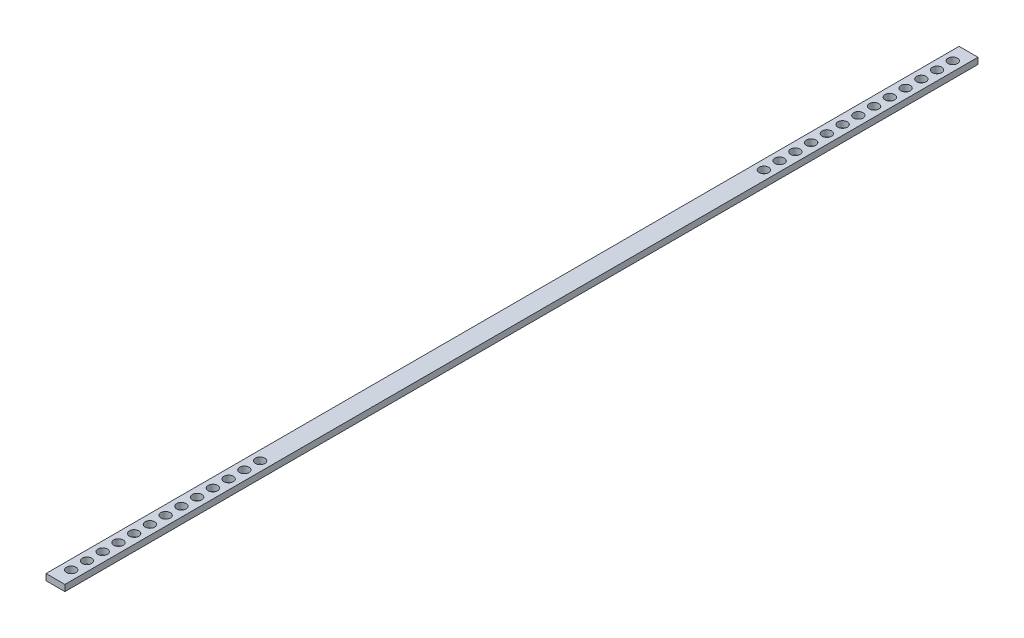
ISO-10303-21;
HEADER;
FILE_DESCRIPTION(('STEP AP214'),'2;1');
FILE_NAME('part.step','',(''),(''),'','','');
FILE_SCHEMA(('AUTOMOTIVE_DESIGN { 1 0 10303 214 1 1 1 1 }'));
ENDSEC;
DATA;
#1=APPLICATION_CONTEXT('core data for automotive mechanical design processes');
#2=APPLICATION_PROTOCOL_DEFINITION('international standard','automotive_design',2000,#1);
#3=PRODUCT_CONTEXT('',#1,'mechanical');
#4=PRODUCT('Part','Part','',(#3));
#5=PRODUCT_RELATED_PRODUCT_CATEGORY('part','',(#4));
#6=PRODUCT_DEFINITION_FORMATION('','',#4);
#7=PRODUCT_DEFINITION_CONTEXT('part definition',#1,'design');
#8=PRODUCT_DEFINITION('design','',#6,#7);
#9=PRODUCT_DEFINITION_SHAPE('','',#8);
#10=(LENGTH_UNIT() NAMED_UNIT(*) SI_UNIT(.MILLI.,.METRE.));
#11=(NAMED_UNIT(*) PLANE_ANGLE_UNIT() SI_UNIT($,.RADIAN.));
#12=(NAMED_UNIT(*) SI_UNIT($,.STERADIAN.) SOLID_ANGLE_UNIT());
#13=UNCERTAINTY_MEASURE_WITH_UNIT(LENGTH_MEASURE(1.E-05),#10,'distance_accuracy_value','');
#14=(GEOMETRIC_REPRESENTATION_CONTEXT(3) GLOBAL_UNCERTAINTY_ASSIGNED_CONTEXT((#13)) GLOBAL_UNIT_ASSIGNED_CONTEXT((#10,
#11,#12)) REPRESENTATION_CONTEXT('',''));
#15=CARTESIAN_POINT('',(0.,0.,0.));
#16=DIRECTION('',(0.,0.,1.));
#17=DIRECTION('',(1.,0.,0.));
#18=AXIS2_PLACEMENT_3D('',#15,#16,#17);
#19=CARTESIAN_POINT('',(0.,0.,580.));
#20=DIRECTION('',(1.,0.,0.));
#21=DIRECTION('',(0.,0.,-1.));
#22=AXIS2_PLACEMENT_3D('',#19,#20,#21);
#23=PLANE('',#22);
#24=DIRECTION('',(0.,-1.,0.));
#25=VECTOR('',#24,1.);
#26=CARTESIAN_POINT('',(0.,0.,0.));
#27=LINE('',#26,#25);
#28=CARTESIAN_POINT('',(0.,4.,0.));
#29=VERTEX_POINT('',#28);
#30=CARTESIAN_POINT('',(0.,0.,0.));
#31=VERTEX_POINT('',#30);
#32=EDGE_CURVE('E107',#29,#31,#27,.T.);
#33=ORIENTED_EDGE('',*,*,#32,.T.);
#34=DIRECTION('',(0.,0.,-1.));
#35=VECTOR('',#34,1.);
#36=CARTESIAN_POINT('',(0.,0.,580.));
#37=LINE('',#36,#35);
#38=CARTESIAN_POINT('',(0.,0.,580.));
#39=VERTEX_POINT('',#38);
#40=EDGE_CURVE('E11',#39,#31,#37,.T.);
#41=ORIENTED_EDGE('',*,*,#40,.F.);
#42=DIRECTION('',(0.,-1.,0.));
#43=VECTOR('',#42,1.);
#44=CARTESIAN_POINT('',(0.,0.,580.));
#45=LINE('',#44,#43);
#46=CARTESIAN_POINT('',(0.,4.,580.));
#47=VERTEX_POINT('',#46);
#48=EDGE_CURVE('E91',#47,#39,#45,.T.);
#49=ORIENTED_EDGE('',*,*,#48,.F.);
#50=DIRECTION('',(0.,0.,-1.));
#51=VECTOR('',#50,1.);
#52=CARTESIAN_POINT('',(0.,4.,580.));
#53=LINE('',#52,#51);
#54=EDGE_CURVE('E103',#47,#29,#53,.T.);
#55=ORIENTED_EDGE('',*,*,#54,.T.);
#56=EDGE_LOOP('',(#33,#41,#49,#55));
#57=FACE_BOUND('',#56,.T.);
#58=ADVANCED_FACE('F39',(#57),#23,.F.);
#59=CARTESIAN_POINT('',(0.,0.,580.));
#60=DIRECTION('',(0.,1.,0.));
#61=DIRECTION('',(0.,0.,1.));
#62=AXIS2_PLACEMENT_3D('',#59,#60,#61);
#63=PLANE('',#62);
#64=CARTESIAN_POINT('',(6.,0.,10.));
#65=DIRECTION('',(0.,1.,0.));
#66=DIRECTION('',(0.,0.,1.));
#67=AXIS2_PLACEMENT_3D('',#64,#65,#66);
#68=CIRCLE('',#67,3.);
#69=CARTESIAN_POINT('',(6.,0.,13.));
#70=VERTEX_POINT('',#69);
#71=EDGE_CURVE('E111',#70,#70,#68,.T.);
#72=ORIENTED_EDGE('',*,*,#71,.T.);
#73=EDGE_LOOP('',(#72));
#74=FACE_BOUND('',#73,.T.);
#75=CARTESIAN_POINT('',(6.,0.,20.));
#76=DIRECTION('',(0.,1.,0.));
#77=DIRECTION('',(0.,0.,1.));
#78=AXIS2_PLACEMENT_3D('',#75,#76,#77);
#79=CIRCLE('',#78,3.);
#80=CARTESIAN_POINT('',(6.,0.,23.));
#81=VERTEX_POINT('',#80);
#82=EDGE_CURVE('E324',#81,#81,#79,.T.);
#83=ORIENTED_EDGE('',*,*,#82,.T.);
#84=EDGE_LOOP('',(#83));
#85=FACE_BOUND('',#84,.T.);
#86=CARTESIAN_POINT('',(6.,0.,30.));
#87=DIRECTION('',(0.,1.,0.));
#88=DIRECTION('',(0.,0.,1.));
#89=AXIS2_PLACEMENT_3D('',#86,#87,#88);
#90=CIRCLE('',#89,3.);
#91=CARTESIAN_POINT('',(6.,0.,33.));
#92=VERTEX_POINT('',#91);
#93=EDGE_CURVE('E316',#92,#92,#90,.T.);
#94=ORIENTED_EDGE('',*,*,#93,.T.);
#95=EDGE_LOOP('',(#94));
#96=FACE_BOUND('',#95,.T.);
#97=CARTESIAN_POINT('',(6.,0.,40.));
#98=DIRECTION('',(0.,1.,0.));
#99=DIRECTION('',(0.,0.,1.));
#100=AXIS2_PLACEMENT_3D('',#97,#98,#99);
#101=CIRCLE('',#100,3.);
#102=CARTESIAN_POINT('',(6.,0.,43.));
#103=VERTEX_POINT('',#102);
#104=EDGE_CURVE('E308',#103,#103,#101,.T.);
#105=ORIENTED_EDGE('',*,*,#104,.T.);
#106=EDGE_LOOP('',(#105));
#107=FACE_BOUND('',#106,.T.);
#108=CARTESIAN_POINT('',(6.00000000000001,0.,50.));
#109=DIRECTION('',(0.,1.,0.));
#110=DIRECTION('',(0.,0.,1.));
#111=AXIS2_PLACEMENT_3D('',#108,#109,#110);
#112=CIRCLE('',#111,3.);
#113=CARTESIAN_POINT('',(6.00000000000001,0.,53.));
#114=VERTEX_POINT('',#113);
#115=EDGE_CURVE('E300',#114,#114,#112,.T.);
#116=ORIENTED_EDGE('',*,*,#115,.T.);
#117=EDGE_LOOP('',(#116));
#118=FACE_BOUND('',#117,.T.);
#119=CARTESIAN_POINT('',(6.00000000000001,0.,60.));
#120=DIRECTION('',(0.,1.,0.));
#121=DIRECTION('',(0.,0.,1.));
#122=AXIS2_PLACEMENT_3D('',#119,#120,#121);
#123=CIRCLE('',#122,3.);
#124=CARTESIAN_POINT('',(6.00000000000001,0.,63.));
#125=VERTEX_POINT('',#124);
#126=EDGE_CURVE('E292',#125,#125,#123,.T.);
#127=ORIENTED_EDGE('',*,*,#126,.T.);
#128=EDGE_LOOP('',(#127));
#129=FACE_BOUND('',#128,.T.);
#130=CARTESIAN_POINT('',(6.00000000000001,0.,70.));
#131=DIRECTION('',(0.,1.,0.));
#132=DIRECTION('',(0.,0.,1.));
#133=AXIS2_PLACEMENT_3D('',#130,#131,#132);
#134=CIRCLE('',#133,3.00000000000001);
#135=CARTESIAN_POINT('',(6.00000000000001,0.,73.));
#136=VERTEX_POINT('',#135);
#137=EDGE_CURVE('E284',#136,#136,#134,.T.);
#138=ORIENTED_EDGE('',*,*,#137,.T.);
#139=EDGE_LOOP('',(#138));
#140=FACE_BOUND('',#139,.T.);
#141=CARTESIAN_POINT('',(6.00000000000001,0.,80.));
#142=DIRECTION('',(0.,1.,0.));
#143=DIRECTION('',(0.,0.,1.));
#144=AXIS2_PLACEMENT_3D('',#141,#142,#143);
#145=CIRCLE('',#144,3.);
#146=CARTESIAN_POINT('',(6.00000000000001,0.,83.));
#147=VERTEX_POINT('',#146);
#148=EDGE_CURVE('E276',#147,#147,#145,.T.);
#149=ORIENTED_EDGE('',*,*,#148,.T.);
#150=EDGE_LOOP('',(#149));
#151=FACE_BOUND('',#150,.T.);
#152=CARTESIAN_POINT('',(6.00000000000001,0.,90.));
#153=DIRECTION('',(0.,1.,0.));
#154=DIRECTION('',(0.,0.,1.));
#155=AXIS2_PLACEMENT_3D('',#152,#153,#154);
#156=CIRCLE('',#155,3.);
#157=CARTESIAN_POINT('',(6.00000000000001,0.,93.));
#158=VERTEX_POINT('',#157);
#159=EDGE_CURVE('E268',#158,#158,#156,.T.);
#160=ORIENTED_EDGE('',*,*,#159,.T.);
#161=EDGE_LOOP('',(#160));
#162=FACE_BOUND('',#161,.T.);
#163=CARTESIAN_POINT('',(6.00000000000001,0.,100.));
#164=DIRECTION('',(0.,1.,0.));
#165=DIRECTION('',(0.,0.,1.));
#166=AXIS2_PLACEMENT_3D('',#163,#164,#165);
#167=CIRCLE('',#166,3.00000000000001);
#168=CARTESIAN_POINT('',(6.00000000000001,0.,103.));
#169=VERTEX_POINT('',#168);
#170=EDGE_CURVE('E260',#169,#169,#167,.T.);
#171=ORIENTED_EDGE('',*,*,#170,.T.);
#172=EDGE_LOOP('',(#171));
#173=FACE_BOUND('',#172,.T.);
#174=CARTESIAN_POINT('',(6.00000000000001,0.,110.));
#175=DIRECTION('',(0.,1.,0.));
#176=DIRECTION('',(0.,0.,1.));
#177=AXIS2_PLACEMENT_3D('',#174,#175,#176);
#178=CIRCLE('',#177,3.00000000000001);
#179=CARTESIAN_POINT('',(6.00000000000001,0.,113.));
#180=VERTEX_POINT('',#179);
#181=EDGE_CURVE('E252',#180,#180,#178,.T.);
#182=ORIENTED_EDGE('',*,*,#181,.T.);
#183=EDGE_LOOP('',(#182));
#184=FACE_BOUND('',#183,.T.);
#185=CARTESIAN_POINT('',(6.00000000000002,0.,120.));
#186=DIRECTION('',(0.,1.,0.));
#187=DIRECTION('',(0.,0.,1.));
#188=AXIS2_PLACEMENT_3D('',#185,#186,#187);
#189=CIRCLE('',#188,3.);
#190=CARTESIAN_POINT('',(6.00000000000002,0.,123.));
#191=VERTEX_POINT('',#190);
#192=EDGE_CURVE('E244',#191,#191,#189,.T.);
#193=ORIENTED_EDGE('',*,*,#192,.T.);
#194=EDGE_LOOP('',(#193));
#195=FACE_BOUND('',#194,.T.);
#196=CARTESIAN_POINT('',(6.00000000000002,0.,130.));
#197=DIRECTION('',(0.,1.,0.));
#198=DIRECTION('',(0.,0.,1.));
#199=AXIS2_PLACEMENT_3D('',#196,#197,#198);
#200=CIRCLE('',#199,3.);
#201=CARTESIAN_POINT('',(6.00000000000002,0.,133.));
#202=VERTEX_POINT('',#201);
#203=EDGE_CURVE('E236',#202,#202,#200,.T.);
#204=ORIENTED_EDGE('',*,*,#203,.T.);
#205=EDGE_LOOP('',(#204));
#206=FACE_BOUND('',#205,.T.);
#207=CARTESIAN_POINT('',(6.00000000000002,0.,450.));
#208=DIRECTION('',(0.,1.,0.));
#209=DIRECTION('',(0.,0.,-1.));
#210=AXIS2_PLACEMENT_3D('',#207,#208,#209);
#211=CIRCLE('',#210,3.);
#212=CARTESIAN_POINT('',(6.00000000000002,0.,447.));
#213=VERTEX_POINT('',#212);
#214=EDGE_CURVE('E228',#213,#213,#211,.T.);
#215=ORIENTED_EDGE('',*,*,#214,.T.);
#216=EDGE_LOOP('',(#215));
#217=FACE_BOUND('',#216,.T.);
#218=CARTESIAN_POINT('',(6.00000000000002,0.,460.));
#219=DIRECTION('',(0.,1.,0.));
#220=DIRECTION('',(0.,0.,-1.));
#221=AXIS2_PLACEMENT_3D('',#218,#219,#220);
#222=CIRCLE('',#221,3.);
#223=CARTESIAN_POINT('',(6.00000000000002,0.,457.));
#224=VERTEX_POINT('',#223);
#225=EDGE_CURVE('E220',#224,#224,#222,.T.);
#226=ORIENTED_EDGE('',*,*,#225,.T.);
#227=EDGE_LOOP('',(#226));
#228=FACE_BOUND('',#227,.T.);
#229=CARTESIAN_POINT('',(6.00000000000001,0.,470.));
#230=DIRECTION('',(0.,1.,0.));
#231=DIRECTION('',(0.,0.,-1.));
#232=AXIS2_PLACEMENT_3D('',#229,#230,#231);
#233=CIRCLE('',#232,3.00000000000001);
#234=CARTESIAN_POINT('',(6.00000000000001,0.,467.));
#235=VERTEX_POINT('',#234);
#236=EDGE_CURVE('E212',#235,#235,#233,.T.);
#237=ORIENTED_EDGE('',*,*,#236,.T.);
#238=EDGE_LOOP('',(#237));
#239=FACE_BOUND('',#238,.T.);
#240=CARTESIAN_POINT('',(6.00000000000001,0.,480.));
#241=DIRECTION('',(0.,1.,0.));
#242=DIRECTION('',(0.,0.,-1.));
#243=AXIS2_PLACEMENT_3D('',#240,#241,#242);
#244=CIRCLE('',#243,3.00000000000001);
#245=CARTESIAN_POINT('',(6.00000000000001,0.,477.));
#246=VERTEX_POINT('',#245);
#247=EDGE_CURVE('E204',#246,#246,#244,.T.);
#248=ORIENTED_EDGE('',*,*,#247,.T.);
#249=EDGE_LOOP('',(#248));
#250=FACE_BOUND('',#249,.T.);
#251=CARTESIAN_POINT('',(6.00000000000001,0.,490.));
#252=DIRECTION('',(0.,1.,0.));
#253=DIRECTION('',(0.,0.,-1.));
#254=AXIS2_PLACEMENT_3D('',#251,#252,#253);
#255=CIRCLE('',#254,3.);
#256=CARTESIAN_POINT('',(6.00000000000001,0.,487.));
#257=VERTEX_POINT('',#256);
#258=EDGE_CURVE('E196',#257,#257,#255,.T.);
#259=ORIENTED_EDGE('',*,*,#258,.T.);
#260=EDGE_LOOP('',(#259));
#261=FACE_BOUND('',#260,.T.);
#262=CARTESIAN_POINT('',(6.00000000000001,0.,500.));
#263=DIRECTION('',(0.,1.,0.));
#264=DIRECTION('',(0.,0.,-1.));
#265=AXIS2_PLACEMENT_3D('',#262,#263,#264);
#266=CIRCLE('',#265,2.99999999999999);
#267=CARTESIAN_POINT('',(6.00000000000001,0.,497.));
#268=VERTEX_POINT('',#267);
#269=EDGE_CURVE('E188',#268,#268,#266,.T.);
#270=ORIENTED_EDGE('',*,*,#269,.T.);
#271=EDGE_LOOP('',(#270));
#272=FACE_BOUND('',#271,.T.);
#273=CARTESIAN_POINT('',(6.00000000000001,0.,510.));
#274=DIRECTION('',(0.,1.,0.));
#275=DIRECTION('',(0.,0.,-1.));
#276=AXIS2_PLACEMENT_3D('',#273,#274,#275);
#277=CIRCLE('',#276,3.00000000000001);
#278=CARTESIAN_POINT('',(6.00000000000001,0.,507.));
#279=VERTEX_POINT('',#278);
#280=EDGE_CURVE('E180',#279,#279,#277,.T.);
#281=ORIENTED_EDGE('',*,*,#280,.T.);
#282=EDGE_LOOP('',(#281));
#283=FACE_BOUND('',#282,.T.);
#284=CARTESIAN_POINT('',(6.00000000000001,0.,520.));
#285=DIRECTION('',(0.,1.,0.));
#286=DIRECTION('',(0.,0.,-1.));
#287=AXIS2_PLACEMENT_3D('',#284,#285,#286);
#288=CIRCLE('',#287,3.);
#289=CARTESIAN_POINT('',(6.00000000000001,0.,517.));
#290=VERTEX_POINT('',#289);
#291=EDGE_CURVE('E172',#290,#290,#288,.T.);
#292=ORIENTED_EDGE('',*,*,#291,.T.);
#293=EDGE_LOOP('',(#292));
#294=FACE_BOUND('',#293,.T.);
#295=CARTESIAN_POINT('',(6.00000000000001,0.,530.));
#296=DIRECTION('',(0.,1.,0.));
#297=DIRECTION('',(0.,0.,-1.));
#298=AXIS2_PLACEMENT_3D('',#295,#296,#297);
#299=CIRCLE('',#298,3.);
#300=CARTESIAN_POINT('',(6.00000000000001,0.,527.));
#301=VERTEX_POINT('',#300);
#302=EDGE_CURVE('E164',#301,#301,#299,.T.);
#303=ORIENTED_EDGE('',*,*,#302,.T.);
#304=EDGE_LOOP('',(#303));
#305=FACE_BOUND('',#304,.T.);
#306=CARTESIAN_POINT('',(6.,0.,540.));
#307=DIRECTION('',(0.,1.,0.));
#308=DIRECTION('',(0.,0.,-1.));
#309=AXIS2_PLACEMENT_3D('',#306,#307,#308);
#310=CIRCLE('',#309,3.00000000000004);
#311=CARTESIAN_POINT('',(6.,0.,537.));
#312=VERTEX_POINT('',#311);
#313=EDGE_CURVE('E156',#312,#312,#310,.T.);
#314=ORIENTED_EDGE('',*,*,#313,.T.);
#315=EDGE_LOOP('',(#314));
#316=FACE_BOUND('',#315,.T.);
#317=CARTESIAN_POINT('',(6.,0.,550.));
#318=DIRECTION('',(0.,1.,0.));
#319=DIRECTION('',(0.,0.,-1.));
#320=AXIS2_PLACEMENT_3D('',#317,#318,#319);
#321=CIRCLE('',#320,3.);
#322=CARTESIAN_POINT('',(6.,0.,547.));
#323=VERTEX_POINT('',#322);
#324=EDGE_CURVE('E148',#323,#323,#321,.T.);
#325=ORIENTED_EDGE('',*,*,#324,.T.);
#326=EDGE_LOOP('',(#325));
#327=FACE_BOUND('',#326,.T.);
#328=CARTESIAN_POINT('',(6.,0.,560.));
#329=DIRECTION('',(0.,1.,0.));
#330=DIRECTION('',(0.,0.,-1.));
#331=AXIS2_PLACEMENT_3D('',#328,#329,#330);
#332=CIRCLE('',#331,3.);
#333=CARTESIAN_POINT('',(6.,0.,557.));
#334=VERTEX_POINT('',#333);
#335=EDGE_CURVE('E140',#334,#334,#332,.T.);
#336=ORIENTED_EDGE('',*,*,#335,.T.);
#337=EDGE_LOOP('',(#336));
#338=FACE_BOUND('',#337,.T.);
#339=CARTESIAN_POINT('',(6.,0.,570.));
#340=DIRECTION('',(0.,1.,0.));
#341=DIRECTION('',(0.,0.,-1.));
#342=AXIS2_PLACEMENT_3D('',#339,#340,#341);
#343=CIRCLE('',#342,3.);
#344=CARTESIAN_POINT('',(6.,0.,567.));
#345=VERTEX_POINT('',#344);
#346=EDGE_CURVE('E132',#345,#345,#343,.T.);
#347=ORIENTED_EDGE('',*,*,#346,.T.);
#348=EDGE_LOOP('',(#347));
#349=FACE_BOUND('',#348,.T.);
#350=DIRECTION('',(1.,0.,0.));
#351=VECTOR('',#350,1.);
#352=CARTESIAN_POINT('',(0.,0.,0.));
#353=LINE('',#352,#351);
#354=CARTESIAN_POINT('',(12.,0.,0.));
#355=VERTEX_POINT('',#354);
#356=EDGE_CURVE('E96',#31,#355,#353,.T.);
#357=ORIENTED_EDGE('',*,*,#356,.T.);
#358=DIRECTION('',(0.,0.,-1.));
#359=VECTOR('',#358,1.);
#360=CARTESIAN_POINT('',(12.,0.,580.));
#361=LINE('',#360,#359);
#362=CARTESIAN_POINT('',(12.,0.,580.));
#363=VERTEX_POINT('',#362);
#364=EDGE_CURVE('E48',#363,#355,#361,.T.);
#365=ORIENTED_EDGE('',*,*,#364,.F.);
#366=DIRECTION('',(1.,0.,0.));
#367=VECTOR('',#366,1.);
#368=CARTESIAN_POINT('',(0.,0.,580.));
#369=LINE('',#368,#367);
#370=EDGE_CURVE('E86',#39,#363,#369,.T.);
#371=ORIENTED_EDGE('',*,*,#370,.F.);
#372=ORIENTED_EDGE('',*,*,#40,.T.);
#373=EDGE_LOOP('',(#357,#365,#371,#372));
#374=FACE_BOUND('',#373,.T.);
#375=ADVANCED_FACE('F95',(#74,#85,#96,#107,#118,#129,#140,#151,#162,#173,#184,#195,#206,#217,
#228,#239,#250,#261,#272,#283,#294,#305,#316,#327,#338,#349,#374),#63,.F.);
#376=CARTESIAN_POINT('',(12.,0.,580.));
#377=DIRECTION('',(-1.,0.,0.));
#378=DIRECTION('',(0.,0.,1.));
#379=AXIS2_PLACEMENT_3D('',#376,#377,#378);
#380=PLANE('',#379);
#381=DIRECTION('',(0.,1.,0.));
#382=VECTOR('',#381,1.);
#383=CARTESIAN_POINT('',(12.,0.,0.));
#384=LINE('',#383,#382);
#385=CARTESIAN_POINT('',(12.,4.,0.));
#386=VERTEX_POINT('',#385);
#387=EDGE_CURVE('E73',#355,#386,#384,.T.);
#388=ORIENTED_EDGE('',*,*,#387,.T.);
#389=DIRECTION('',(0.,0.,-1.));
#390=VECTOR('',#389,1.);
#391=CARTESIAN_POINT('',(12.,4.,580.));
#392=LINE('',#391,#390);
#393=CARTESIAN_POINT('',(12.,4.,580.));
#394=VERTEX_POINT('',#393);
#395=EDGE_CURVE('E98',#394,#386,#392,.T.);
#396=ORIENTED_EDGE('',*,*,#395,.F.);
#397=DIRECTION('',(0.,1.,0.));
#398=VECTOR('',#397,1.);
#399=CARTESIAN_POINT('',(12.,0.,580.));
#400=LINE('',#399,#398);
#401=EDGE_CURVE('E89',#363,#394,#400,.T.);
#402=ORIENTED_EDGE('',*,*,#401,.F.);
#403=ORIENTED_EDGE('',*,*,#364,.T.);
#404=EDGE_LOOP('',(#388,#396,#402,#403));
#405=FACE_BOUND('',#404,.T.);
#406=ADVANCED_FACE('F99',(#405),#380,.F.);
#407=CARTESIAN_POINT('',(0.,4.,580.));
#408=DIRECTION('',(0.,-1.,0.));
#409=DIRECTION('',(0.,0.,-1.));
#410=AXIS2_PLACEMENT_3D('',#407,#408,#409);
#411=PLANE('',#410);
#412=CARTESIAN_POINT('',(6.,4.,10.));
#413=DIRECTION('',(0.,1.,0.));
#414=DIRECTION('',(0.,0.,1.));
#415=AXIS2_PLACEMENT_3D('',#412,#413,#414);
#416=CIRCLE('',#415,3.);
#417=CARTESIAN_POINT('',(6.,4.,13.));
#418=VERTEX_POINT('',#417);
#419=EDGE_CURVE('E328',#418,#418,#416,.T.);
#420=ORIENTED_EDGE('',*,*,#419,.F.);
#421=EDGE_LOOP('',(#420));
#422=FACE_BOUND('',#421,.T.);
#423=CARTESIAN_POINT('',(6.,4.,20.));
#424=DIRECTION('',(0.,1.,0.));
#425=DIRECTION('',(0.,0.,1.));
#426=AXIS2_PLACEMENT_3D('',#423,#424,#425);
#427=CIRCLE('',#426,3.);
#428=CARTESIAN_POINT('',(6.,4.,23.));
#429=VERTEX_POINT('',#428);
#430=EDGE_CURVE('E320',#429,#429,#427,.T.);
#431=ORIENTED_EDGE('',*,*,#430,.F.);
#432=EDGE_LOOP('',(#431));
#433=FACE_BOUND('',#432,.T.);
#434=CARTESIAN_POINT('',(6.,4.,30.));
#435=DIRECTION('',(0.,1.,0.));
#436=DIRECTION('',(0.,0.,1.));
#437=AXIS2_PLACEMENT_3D('',#434,#435,#436);
#438=CIRCLE('',#437,3.);
#439=CARTESIAN_POINT('',(6.,4.,33.));
#440=VERTEX_POINT('',#439);
#441=EDGE_CURVE('E312',#440,#440,#438,.T.);
#442=ORIENTED_EDGE('',*,*,#441,.F.);
#443=EDGE_LOOP('',(#442));
#444=FACE_BOUND('',#443,.T.);
#445=CARTESIAN_POINT('',(6.,4.,40.));
#446=DIRECTION('',(0.,1.,0.));
#447=DIRECTION('',(0.,0.,1.));
#448=AXIS2_PLACEMENT_3D('',#445,#446,#447);
#449=CIRCLE('',#448,3.);
#450=CARTESIAN_POINT('',(6.,4.,43.));
#451=VERTEX_POINT('',#450);
#452=EDGE_CURVE('E304',#451,#451,#449,.T.);
#453=ORIENTED_EDGE('',*,*,#452,.F.);
#454=EDGE_LOOP('',(#453));
#455=FACE_BOUND('',#454,.T.);
#456=CARTESIAN_POINT('',(6.00000000000001,4.,50.));
#457=DIRECTION('',(0.,1.,0.));
#458=DIRECTION('',(0.,0.,1.));
#459=AXIS2_PLACEMENT_3D('',#456,#457,#458);
#460=CIRCLE('',#459,3.);
#461=CARTESIAN_POINT('',(6.00000000000001,4.,53.));
#462=VERTEX_POINT('',#461);
#463=EDGE_CURVE('E296',#462,#462,#460,.T.);
#464=ORIENTED_EDGE('',*,*,#463,.F.);
#465=EDGE_LOOP('',(#464));
#466=FACE_BOUND('',#465,.T.);
#467=CARTESIAN_POINT('',(6.00000000000001,4.,60.));
#468=DIRECTION('',(0.,1.,0.));
#469=DIRECTION('',(0.,0.,1.));
#470=AXIS2_PLACEMENT_3D('',#467,#468,#469);
#471=CIRCLE('',#470,3.);
#472=CARTESIAN_POINT('',(6.00000000000001,4.,63.));
#473=VERTEX_POINT('',#472);
#474=EDGE_CURVE('E288',#473,#473,#471,.T.);
#475=ORIENTED_EDGE('',*,*,#474,.F.);
#476=EDGE_LOOP('',(#475));
#477=FACE_BOUND('',#476,.T.);
#478=CARTESIAN_POINT('',(6.00000000000001,4.,70.));
#479=DIRECTION('',(0.,1.,0.));
#480=DIRECTION('',(0.,0.,1.));
#481=AXIS2_PLACEMENT_3D('',#478,#479,#480);
#482=CIRCLE('',#481,3.00000000000001);
#483=CARTESIAN_POINT('',(6.00000000000001,4.,73.));
#484=VERTEX_POINT('',#483);
#485=EDGE_CURVE('E280',#484,#484,#482,.T.);
#486=ORIENTED_EDGE('',*,*,#485,.F.);
#487=EDGE_LOOP('',(#486));
#488=FACE_BOUND('',#487,.T.);
#489=CARTESIAN_POINT('',(6.00000000000001,4.,80.));
#490=DIRECTION('',(0.,1.,0.));
#491=DIRECTION('',(0.,0.,1.));
#492=AXIS2_PLACEMENT_3D('',#489,#490,#491);
#493=CIRCLE('',#492,3.);
#494=CARTESIAN_POINT('',(6.00000000000001,4.,83.));
#495=VERTEX_POINT('',#494);
#496=EDGE_CURVE('E272',#495,#495,#493,.T.);
#497=ORIENTED_EDGE('',*,*,#496,.F.);
#498=EDGE_LOOP('',(#497));
#499=FACE_BOUND('',#498,.T.);
#500=CARTESIAN_POINT('',(6.00000000000001,4.,90.));
#501=DIRECTION('',(0.,1.,0.));
#502=DIRECTION('',(0.,0.,1.));
#503=AXIS2_PLACEMENT_3D('',#500,#501,#502);
#504=CIRCLE('',#503,3.);
#505=CARTESIAN_POINT('',(6.00000000000001,4.,93.));
#506=VERTEX_POINT('',#505);
#507=EDGE_CURVE('E264',#506,#506,#504,.T.);
#508=ORIENTED_EDGE('',*,*,#507,.F.);
#509=EDGE_LOOP('',(#508));
#510=FACE_BOUND('',#509,.T.);
#511=CARTESIAN_POINT('',(6.00000000000001,4.,100.));
#512=DIRECTION('',(0.,1.,0.));
#513=DIRECTION('',(0.,0.,1.));
#514=AXIS2_PLACEMENT_3D('',#511,#512,#513);
#515=CIRCLE('',#514,3.00000000000001);
#516=CARTESIAN_POINT('',(6.00000000000001,4.,103.));
#517=VERTEX_POINT('',#516);
#518=EDGE_CURVE('E256',#517,#517,#515,.T.);
#519=ORIENTED_EDGE('',*,*,#518,.F.);
#520=EDGE_LOOP('',(#519));
#521=FACE_BOUND('',#520,.T.);
#522=CARTESIAN_POINT('',(6.00000000000001,4.,110.));
#523=DIRECTION('',(0.,1.,0.));
#524=DIRECTION('',(0.,0.,1.));
#525=AXIS2_PLACEMENT_3D('',#522,#523,#524);
#526=CIRCLE('',#525,3.00000000000001);
#527=CARTESIAN_POINT('',(6.00000000000001,4.,113.));
#528=VERTEX_POINT('',#527);
#529=EDGE_CURVE('E248',#528,#528,#526,.T.);
#530=ORIENTED_EDGE('',*,*,#529,.F.);
#531=EDGE_LOOP('',(#530));
#532=FACE_BOUND('',#531,.T.);
#533=CARTESIAN_POINT('',(6.00000000000002,4.,120.));
#534=DIRECTION('',(0.,1.,0.));
#535=DIRECTION('',(0.,0.,1.));
#536=AXIS2_PLACEMENT_3D('',#533,#534,#535);
#537=CIRCLE('',#536,3.);
#538=CARTESIAN_POINT('',(6.00000000000002,4.,123.));
#539=VERTEX_POINT('',#538);
#540=EDGE_CURVE('E240',#539,#539,#537,.T.);
#541=ORIENTED_EDGE('',*,*,#540,.F.);
#542=EDGE_LOOP('',(#541));
#543=FACE_BOUND('',#542,.T.);
#544=CARTESIAN_POINT('',(6.00000000000002,4.,130.));
#545=DIRECTION('',(0.,1.,0.));
#546=DIRECTION('',(0.,0.,1.));
#547=AXIS2_PLACEMENT_3D('',#544,#545,#546);
#548=CIRCLE('',#547,3.);
#549=CARTESIAN_POINT('',(6.00000000000002,4.,133.));
#550=VERTEX_POINT('',#549);
#551=EDGE_CURVE('E232',#550,#550,#548,.T.);
#552=ORIENTED_EDGE('',*,*,#551,.F.);
#553=EDGE_LOOP('',(#552));
#554=FACE_BOUND('',#553,.T.);
#555=CARTESIAN_POINT('',(6.00000000000002,4.,450.));
#556=DIRECTION('',(0.,1.,0.));
#557=DIRECTION('',(0.,0.,-1.));
#558=AXIS2_PLACEMENT_3D('',#555,#556,#557);
#559=CIRCLE('',#558,3.);
#560=CARTESIAN_POINT('',(6.00000000000002,4.,447.));
#561=VERTEX_POINT('',#560);
#562=EDGE_CURVE('E224',#561,#561,#559,.T.);
#563=ORIENTED_EDGE('',*,*,#562,.F.);
#564=EDGE_LOOP('',(#563));
#565=FACE_BOUND('',#564,.T.);
#566=CARTESIAN_POINT('',(6.00000000000002,4.,460.));
#567=DIRECTION('',(0.,1.,0.));
#568=DIRECTION('',(0.,0.,-1.));
#569=AXIS2_PLACEMENT_3D('',#566,#567,#568);
#570=CIRCLE('',#569,3.);
#571=CARTESIAN_POINT('',(6.00000000000002,4.,457.));
#572=VERTEX_POINT('',#571);
#573=EDGE_CURVE('E216',#572,#572,#570,.T.);
#574=ORIENTED_EDGE('',*,*,#573,.F.);
#575=EDGE_LOOP('',(#574));
#576=FACE_BOUND('',#575,.T.);
#577=CARTESIAN_POINT('',(6.00000000000001,4.,470.));
#578=DIRECTION('',(0.,1.,0.));
#579=DIRECTION('',(0.,0.,-1.));
#580=AXIS2_PLACEMENT_3D('',#577,#578,#579);
#581=CIRCLE('',#580,3.00000000000001);
#582=CARTESIAN_POINT('',(6.00000000000001,4.,467.));
#583=VERTEX_POINT('',#582);
#584=EDGE_CURVE('E208',#583,#583,#581,.T.);
#585=ORIENTED_EDGE('',*,*,#584,.F.);
#586=EDGE_LOOP('',(#585));
#587=FACE_BOUND('',#586,.T.);
#588=CARTESIAN_POINT('',(6.00000000000001,4.,480.));
#589=DIRECTION('',(0.,1.,0.));
#590=DIRECTION('',(0.,0.,-1.));
#591=AXIS2_PLACEMENT_3D('',#588,#589,#590);
#592=CIRCLE('',#591,3.00000000000001);
#593=CARTESIAN_POINT('',(6.00000000000001,4.,477.));
#594=VERTEX_POINT('',#593);
#595=EDGE_CURVE('E200',#594,#594,#592,.T.);
#596=ORIENTED_EDGE('',*,*,#595,.F.);
#597=EDGE_LOOP('',(#596));
#598=FACE_BOUND('',#597,.T.);
#599=CARTESIAN_POINT('',(6.00000000000001,4.,490.));
#600=DIRECTION('',(0.,1.,0.));
#601=DIRECTION('',(0.,0.,-1.));
#602=AXIS2_PLACEMENT_3D('',#599,#600,#601);
#603=CIRCLE('',#602,3.);
#604=CARTESIAN_POINT('',(6.00000000000001,4.,487.));
#605=VERTEX_POINT('',#604);
#606=EDGE_CURVE('E192',#605,#605,#603,.T.);
#607=ORIENTED_EDGE('',*,*,#606,.F.);
#608=EDGE_LOOP('',(#607));
#609=FACE_BOUND('',#608,.T.);
#610=CARTESIAN_POINT('',(6.00000000000001,4.,500.));
#611=DIRECTION('',(0.,1.,0.));
#612=DIRECTION('',(0.,0.,-1.));
#613=AXIS2_PLACEMENT_3D('',#610,#611,#612);
#614=CIRCLE('',#613,2.99999999999999);
#615=CARTESIAN_POINT('',(6.00000000000001,4.,497.));
#616=VERTEX_POINT('',#615);
#617=EDGE_CURVE('E184',#616,#616,#614,.T.);
#618=ORIENTED_EDGE('',*,*,#617,.F.);
#619=EDGE_LOOP('',(#618));
#620=FACE_BOUND('',#619,.T.);
#621=CARTESIAN_POINT('',(6.00000000000001,4.,510.));
#622=DIRECTION('',(0.,1.,0.));
#623=DIRECTION('',(0.,0.,-1.));
#624=AXIS2_PLACEMENT_3D('',#621,#622,#623);
#625=CIRCLE('',#624,3.00000000000001);
#626=CARTESIAN_POINT('',(6.00000000000001,4.,507.));
#627=VERTEX_POINT('',#626);
#628=EDGE_CURVE('E176',#627,#627,#625,.T.);
#629=ORIENTED_EDGE('',*,*,#628,.F.);
#630=EDGE_LOOP('',(#629));
#631=FACE_BOUND('',#630,.T.);
#632=CARTESIAN_POINT('',(6.00000000000001,4.,520.));
#633=DIRECTION('',(0.,1.,0.));
#634=DIRECTION('',(0.,0.,-1.));
#635=AXIS2_PLACEMENT_3D('',#632,#633,#634);
#636=CIRCLE('',#635,3.);
#637=CARTESIAN_POINT('',(6.00000000000001,4.,517.));
#638=VERTEX_POINT('',#637);
#639=EDGE_CURVE('E168',#638,#638,#636,.T.);
#640=ORIENTED_EDGE('',*,*,#639,.F.);
#641=EDGE_LOOP('',(#640));
#642=FACE_BOUND('',#641,.T.);
#643=CARTESIAN_POINT('',(6.00000000000001,4.,530.));
#644=DIRECTION('',(0.,1.,0.));
#645=DIRECTION('',(0.,0.,-1.));
#646=AXIS2_PLACEMENT_3D('',#643,#644,#645);
#647=CIRCLE('',#646,3.);
#648=CARTESIAN_POINT('',(6.00000000000001,4.,527.));
#649=VERTEX_POINT('',#648);
#650=EDGE_CURVE('E160',#649,#649,#647,.T.);
#651=ORIENTED_EDGE('',*,*,#650,.F.);
#652=EDGE_LOOP('',(#651));
#653=FACE_BOUND('',#652,.T.);
#654=CARTESIAN_POINT('',(6.,4.,540.));
#655=DIRECTION('',(0.,1.,0.));
#656=DIRECTION('',(0.,0.,-1.));
#657=AXIS2_PLACEMENT_3D('',#654,#655,#656);
#658=CIRCLE('',#657,3.00000000000004);
#659=CARTESIAN_POINT('',(6.,4.,537.));
#660=VERTEX_POINT('',#659);
#661=EDGE_CURVE('E152',#660,#660,#658,.T.);
#662=ORIENTED_EDGE('',*,*,#661,.F.);
#663=EDGE_LOOP('',(#662));
#664=FACE_BOUND('',#663,.T.);
#665=CARTESIAN_POINT('',(6.,4.,550.));
#666=DIRECTION('',(0.,1.,0.));
#667=DIRECTION('',(0.,0.,-1.));
#668=AXIS2_PLACEMENT_3D('',#665,#666,#667);
#669=CIRCLE('',#668,3.);
#670=CARTESIAN_POINT('',(6.,4.,547.));
#671=VERTEX_POINT('',#670);
#672=EDGE_CURVE('E144',#671,#671,#669,.T.);
#673=ORIENTED_EDGE('',*,*,#672,.F.);
#674=EDGE_LOOP('',(#673));
#675=FACE_BOUND('',#674,.T.);
#676=CARTESIAN_POINT('',(6.,4.,560.));
#677=DIRECTION('',(0.,1.,0.));
#678=DIRECTION('',(0.,0.,-1.));
#679=AXIS2_PLACEMENT_3D('',#676,#677,#678);
#680=CIRCLE('',#679,3.);
#681=CARTESIAN_POINT('',(6.,4.,557.));
#682=VERTEX_POINT('',#681);
#683=EDGE_CURVE('E136',#682,#682,#680,.T.);
#684=ORIENTED_EDGE('',*,*,#683,.F.);
#685=EDGE_LOOP('',(#684));
#686=FACE_BOUND('',#685,.T.);
#687=CARTESIAN_POINT('',(6.,4.,570.));
#688=DIRECTION('',(0.,1.,0.));
#689=DIRECTION('',(0.,0.,-1.));
#690=AXIS2_PLACEMENT_3D('',#687,#688,#689);
#691=CIRCLE('',#690,3.);
#692=CARTESIAN_POINT('',(6.,4.,567.));
#693=VERTEX_POINT('',#692);
#694=EDGE_CURVE('E128',#693,#693,#691,.T.);
#695=ORIENTED_EDGE('',*,*,#694,.F.);
#696=EDGE_LOOP('',(#695));
#697=FACE_BOUND('',#696,.T.);
#698=DIRECTION('',(-1.,0.,0.));
#699=VECTOR('',#698,1.);
#700=CARTESIAN_POINT('',(0.,4.,0.));
#701=LINE('',#700,#699);
#702=EDGE_CURVE('E79',#386,#29,#701,.T.);
#703=ORIENTED_EDGE('',*,*,#702,.T.);
#704=ORIENTED_EDGE('',*,*,#54,.F.);
#705=DIRECTION('',(-1.,0.,0.));
#706=VECTOR('',#705,1.);
#707=CARTESIAN_POINT('',(0.,4.,580.));
#708=LINE('',#707,#706);
#709=EDGE_CURVE('E56',#394,#47,#708,.T.);
#710=ORIENTED_EDGE('',*,*,#709,.F.);
#711=ORIENTED_EDGE('',*,*,#395,.T.);
#712=EDGE_LOOP('',(#703,#704,#710,#711));
#713=FACE_BOUND('',#712,.T.);
#714=ADVANCED_FACE('F121',(#422,#433,#444,#455,#466,#477,#488,#499,#510,#521,#532,#543,#554,
#565,#576,#587,#598,#609,#620,#631,#642,#653,#664,#675,#686,#697,#713),#411,.F.);
#715=CARTESIAN_POINT('',(0.,0.,580.));
#716=DIRECTION('',(0.,0.,-1.));
#717=DIRECTION('',(-1.,0.,0.));
#718=AXIS2_PLACEMENT_3D('',#715,#716,#717);
#719=PLANE('',#718);
#720=ORIENTED_EDGE('',*,*,#48,.T.);
#721=ORIENTED_EDGE('',*,*,#370,.T.);
#722=ORIENTED_EDGE('',*,*,#401,.T.);
#723=ORIENTED_EDGE('',*,*,#709,.T.);
#724=EDGE_LOOP('',(#720,#721,#722,#723));
#725=FACE_BOUND('',#724,.T.);
#726=ADVANCED_FACE('F87',(#725),#719,.F.);
#727=CARTESIAN_POINT('',(0.,0.,0.));
#728=DIRECTION('',(0.,0.,-1.));
#729=DIRECTION('',(-1.,0.,0.));
#730=AXIS2_PLACEMENT_3D('',#727,#728,#729);
#731=PLANE('',#730);
#732=ORIENTED_EDGE('',*,*,#32,.F.);
#733=ORIENTED_EDGE('',*,*,#702,.F.);
#734=ORIENTED_EDGE('',*,*,#387,.F.);
#735=ORIENTED_EDGE('',*,*,#356,.F.);
#736=EDGE_LOOP('',(#732,#733,#734,#735));
#737=FACE_BOUND('',#736,.T.);
#738=ADVANCED_FACE('F124',(#737),#731,.T.);
#739=CARTESIAN_POINT('',(6.,0.,570.));
#740=DIRECTION('',(0.,1.,0.));
#741=DIRECTION('',(0.,0.,1.));
#742=AXIS2_PLACEMENT_3D('',#739,#740,#741);
#743=CYLINDRICAL_SURFACE('',#742,3.);
#744=ORIENTED_EDGE('',*,*,#346,.F.);
#745=EDGE_LOOP('',(#744));
#746=FACE_BOUND('',#745,.T.);
#747=ORIENTED_EDGE('',*,*,#694,.T.);
#748=EDGE_LOOP('',(#747));
#749=FACE_BOUND('',#748,.T.);
#750=ADVANCED_FACE('F398',(#746,#749),#743,.F.);
#751=CARTESIAN_POINT('',(6.,0.,560.));
#752=DIRECTION('',(0.,1.,0.));
#753=DIRECTION('',(0.,0.,1.));
#754=AXIS2_PLACEMENT_3D('',#751,#752,#753);
#755=CYLINDRICAL_SURFACE('',#754,3.);
#756=ORIENTED_EDGE('',*,*,#335,.F.);
#757=EDGE_LOOP('',(#756));
#758=FACE_BOUND('',#757,.T.);
#759=ORIENTED_EDGE('',*,*,#683,.T.);
#760=EDGE_LOOP('',(#759));
#761=FACE_BOUND('',#760,.T.);
#762=ADVANCED_FACE('F400',(#758,#761),#755,.F.);
#763=CARTESIAN_POINT('',(6.,0.,550.));
#764=DIRECTION('',(0.,1.,0.));
#765=DIRECTION('',(0.,0.,1.));
#766=AXIS2_PLACEMENT_3D('',#763,#764,#765);
#767=CYLINDRICAL_SURFACE('',#766,3.);
#768=ORIENTED_EDGE('',*,*,#324,.F.);
#769=EDGE_LOOP('',(#768));
#770=FACE_BOUND('',#769,.T.);
#771=ORIENTED_EDGE('',*,*,#672,.T.);
#772=EDGE_LOOP('',(#771));
#773=FACE_BOUND('',#772,.T.);
#774=ADVANCED_FACE('F407',(#770,#773),#767,.F.);
#775=CARTESIAN_POINT('',(6.,0.,540.));
#776=DIRECTION('',(0.,1.,0.));
#777=DIRECTION('',(0.,0.,1.));
#778=AXIS2_PLACEMENT_3D('',#775,#776,#777);
#779=CYLINDRICAL_SURFACE('',#778,3.00000000000004);
#780=ORIENTED_EDGE('',*,*,#313,.F.);
#781=EDGE_LOOP('',(#780));
#782=FACE_BOUND('',#781,.T.);
#783=ORIENTED_EDGE('',*,*,#661,.T.);
#784=EDGE_LOOP('',(#783));
#785=FACE_BOUND('',#784,.T.);
#786=ADVANCED_FACE('F460',(#782,#785),#779,.F.);
#787=CARTESIAN_POINT('',(6.00000000000001,0.,530.));
#788=DIRECTION('',(0.,1.,0.));
#789=DIRECTION('',(0.,0.,1.));
#790=AXIS2_PLACEMENT_3D('',#787,#788,#789);
#791=CYLINDRICAL_SURFACE('',#790,3.);
#792=ORIENTED_EDGE('',*,*,#302,.F.);
#793=EDGE_LOOP('',(#792));
#794=FACE_BOUND('',#793,.T.);
#795=ORIENTED_EDGE('',*,*,#650,.T.);
#796=EDGE_LOOP('',(#795));
#797=FACE_BOUND('',#796,.T.);
#798=ADVANCED_FACE('F470',(#794,#797),#791,.F.);
#799=CARTESIAN_POINT('',(6.00000000000001,0.,520.));
#800=DIRECTION('',(0.,1.,0.));
#801=DIRECTION('',(0.,0.,1.));
#802=AXIS2_PLACEMENT_3D('',#799,#800,#801);
#803=CYLINDRICAL_SURFACE('',#802,3.);
#804=ORIENTED_EDGE('',*,*,#291,.F.);
#805=EDGE_LOOP('',(#804));
#806=FACE_BOUND('',#805,.T.);
#807=ORIENTED_EDGE('',*,*,#639,.T.);
#808=EDGE_LOOP('',(#807));
#809=FACE_BOUND('',#808,.T.);
#810=ADVANCED_FACE('F480',(#806,#809),#803,.F.);
#811=CARTESIAN_POINT('',(6.00000000000001,0.,510.));
#812=DIRECTION('',(0.,1.,0.));
#813=DIRECTION('',(0.,0.,1.));
#814=AXIS2_PLACEMENT_3D('',#811,#812,#813);
#815=CYLINDRICAL_SURFACE('',#814,3.00000000000001);
#816=ORIENTED_EDGE('',*,*,#280,.F.);
#817=EDGE_LOOP('',(#816));
#818=FACE_BOUND('',#817,.T.);
#819=ORIENTED_EDGE('',*,*,#628,.T.);
#820=EDGE_LOOP('',(#819));
#821=FACE_BOUND('',#820,.T.);
#822=ADVANCED_FACE('F490',(#818,#821),#815,.F.);
#823=CARTESIAN_POINT('',(6.00000000000001,0.,500.));
#824=DIRECTION('',(0.,1.,0.));
#825=DIRECTION('',(0.,0.,1.));
#826=AXIS2_PLACEMENT_3D('',#823,#824,#825);
#827=CYLINDRICAL_SURFACE('',#826,2.99999999999999);
#828=ORIENTED_EDGE('',*,*,#269,.F.);
#829=EDGE_LOOP('',(#828));
#830=FACE_BOUND('',#829,.T.);
#831=ORIENTED_EDGE('',*,*,#617,.T.);
#832=EDGE_LOOP('',(#831));
#833=FACE_BOUND('',#832,.T.);
#834=ADVANCED_FACE('F500',(#830,#833),#827,.F.);
#835=CARTESIAN_POINT('',(6.00000000000001,0.,490.));
#836=DIRECTION('',(0.,1.,0.));
#837=DIRECTION('',(0.,0.,1.));
#838=AXIS2_PLACEMENT_3D('',#835,#836,#837);
#839=CYLINDRICAL_SURFACE('',#838,3.);
#840=ORIENTED_EDGE('',*,*,#258,.F.);
#841=EDGE_LOOP('',(#840));
#842=FACE_BOUND('',#841,.T.);
#843=ORIENTED_EDGE('',*,*,#606,.T.);
#844=EDGE_LOOP('',(#843));
#845=FACE_BOUND('',#844,.T.);
#846=ADVANCED_FACE('F510',(#842,#845),#839,.F.);
#847=CARTESIAN_POINT('',(6.00000000000001,0.,480.));
#848=DIRECTION('',(0.,1.,0.));
#849=DIRECTION('',(0.,0.,1.));
#850=AXIS2_PLACEMENT_3D('',#847,#848,#849);
#851=CYLINDRICAL_SURFACE('',#850,3.00000000000001);
#852=ORIENTED_EDGE('',*,*,#247,.F.);
#853=EDGE_LOOP('',(#852));
#854=FACE_BOUND('',#853,.T.);
#855=ORIENTED_EDGE('',*,*,#595,.T.);
#856=EDGE_LOOP('',(#855));
#857=FACE_BOUND('',#856,.T.);
#858=ADVANCED_FACE('F520',(#854,#857),#851,.F.);
#859=CARTESIAN_POINT('',(6.00000000000001,0.,470.));
#860=DIRECTION('',(0.,1.,0.));
#861=DIRECTION('',(0.,0.,1.));
#862=AXIS2_PLACEMENT_3D('',#859,#860,#861);
#863=CYLINDRICAL_SURFACE('',#862,3.00000000000001);
#864=ORIENTED_EDGE('',*,*,#236,.F.);
#865=EDGE_LOOP('',(#864));
#866=FACE_BOUND('',#865,.T.);
#867=ORIENTED_EDGE('',*,*,#584,.T.);
#868=EDGE_LOOP('',(#867));
#869=FACE_BOUND('',#868,.T.);
#870=ADVANCED_FACE('F530',(#866,#869),#863,.F.);
#871=CARTESIAN_POINT('',(6.00000000000002,0.,460.));
#872=DIRECTION('',(0.,1.,0.));
#873=DIRECTION('',(0.,0.,1.));
#874=AXIS2_PLACEMENT_3D('',#871,#872,#873);
#875=CYLINDRICAL_SURFACE('',#874,3.);
#876=ORIENTED_EDGE('',*,*,#225,.F.);
#877=EDGE_LOOP('',(#876));
#878=FACE_BOUND('',#877,.T.);
#879=ORIENTED_EDGE('',*,*,#573,.T.);
#880=EDGE_LOOP('',(#879));
#881=FACE_BOUND('',#880,.T.);
#882=ADVANCED_FACE('F540',(#878,#881),#875,.F.);
#883=CARTESIAN_POINT('',(6.00000000000002,0.,450.));
#884=DIRECTION('',(0.,1.,0.));
#885=DIRECTION('',(0.,0.,1.));
#886=AXIS2_PLACEMENT_3D('',#883,#884,#885);
#887=CYLINDRICAL_SURFACE('',#886,3.);
#888=ORIENTED_EDGE('',*,*,#214,.F.);
#889=EDGE_LOOP('',(#888));
#890=FACE_BOUND('',#889,.T.);
#891=ORIENTED_EDGE('',*,*,#562,.T.);
#892=EDGE_LOOP('',(#891));
#893=FACE_BOUND('',#892,.T.);
#894=ADVANCED_FACE('F550',(#890,#893),#887,.F.);
#895=CARTESIAN_POINT('',(6.00000000000002,0.,130.));
#896=DIRECTION('',(0.,1.,0.));
#897=DIRECTION('',(0.,0.,1.));
#898=AXIS2_PLACEMENT_3D('',#895,#896,#897);
#899=CYLINDRICAL_SURFACE('',#898,3.);
#900=ORIENTED_EDGE('',*,*,#203,.F.);
#901=EDGE_LOOP('',(#900));
#902=FACE_BOUND('',#901,.T.);
#903=ORIENTED_EDGE('',*,*,#551,.T.);
#904=EDGE_LOOP('',(#903));
#905=FACE_BOUND('',#904,.T.);
#906=ADVANCED_FACE('F560',(#902,#905),#899,.F.);
#907=CARTESIAN_POINT('',(6.00000000000002,0.,120.));
#908=DIRECTION('',(0.,1.,0.));
#909=DIRECTION('',(0.,0.,1.));
#910=AXIS2_PLACEMENT_3D('',#907,#908,#909);
#911=CYLINDRICAL_SURFACE('',#910,3.);
#912=ORIENTED_EDGE('',*,*,#192,.F.);
#913=EDGE_LOOP('',(#912));
#914=FACE_BOUND('',#913,.T.);
#915=ORIENTED_EDGE('',*,*,#540,.T.);
#916=EDGE_LOOP('',(#915));
#917=FACE_BOUND('',#916,.T.);
#918=ADVANCED_FACE('F570',(#914,#917),#911,.F.);
#919=CARTESIAN_POINT('',(6.00000000000001,0.,110.));
#920=DIRECTION('',(0.,1.,0.));
#921=DIRECTION('',(0.,0.,1.));
#922=AXIS2_PLACEMENT_3D('',#919,#920,#921);
#923=CYLINDRICAL_SURFACE('',#922,3.00000000000001);
#924=ORIENTED_EDGE('',*,*,#181,.F.);
#925=EDGE_LOOP('',(#924));
#926=FACE_BOUND('',#925,.T.);
#927=ORIENTED_EDGE('',*,*,#529,.T.);
#928=EDGE_LOOP('',(#927));
#929=FACE_BOUND('',#928,.T.);
#930=ADVANCED_FACE('F580',(#926,#929),#923,.F.);
#931=CARTESIAN_POINT('',(6.00000000000001,0.,100.));
#932=DIRECTION('',(0.,1.,0.));
#933=DIRECTION('',(0.,0.,1.));
#934=AXIS2_PLACEMENT_3D('',#931,#932,#933);
#935=CYLINDRICAL_SURFACE('',#934,3.00000000000001);
#936=ORIENTED_EDGE('',*,*,#170,.F.);
#937=EDGE_LOOP('',(#936));
#938=FACE_BOUND('',#937,.T.);
#939=ORIENTED_EDGE('',*,*,#518,.T.);
#940=EDGE_LOOP('',(#939));
#941=FACE_BOUND('',#940,.T.);
#942=ADVANCED_FACE('F590',(#938,#941),#935,.F.);
#943=CARTESIAN_POINT('',(6.00000000000001,0.,90.));
#944=DIRECTION('',(0.,1.,0.));
#945=DIRECTION('',(0.,0.,1.));
#946=AXIS2_PLACEMENT_3D('',#943,#944,#945);
#947=CYLINDRICAL_SURFACE('',#946,3.);
#948=ORIENTED_EDGE('',*,*,#159,.F.);
#949=EDGE_LOOP('',(#948));
#950=FACE_BOUND('',#949,.T.);
#951=ORIENTED_EDGE('',*,*,#507,.T.);
#952=EDGE_LOOP('',(#951));
#953=FACE_BOUND('',#952,.T.);
#954=ADVANCED_FACE('F600',(#950,#953),#947,.F.);
#955=CARTESIAN_POINT('',(6.00000000000001,0.,80.));
#956=DIRECTION('',(0.,1.,0.));
#957=DIRECTION('',(0.,0.,1.));
#958=AXIS2_PLACEMENT_3D('',#955,#956,#957);
#959=CYLINDRICAL_SURFACE('',#958,3.);
#960=ORIENTED_EDGE('',*,*,#148,.F.);
#961=EDGE_LOOP('',(#960));
#962=FACE_BOUND('',#961,.T.);
#963=ORIENTED_EDGE('',*,*,#496,.T.);
#964=EDGE_LOOP('',(#963));
#965=FACE_BOUND('',#964,.T.);
#966=ADVANCED_FACE('F610',(#962,#965),#959,.F.);
#967=CARTESIAN_POINT('',(6.00000000000001,0.,70.));
#968=DIRECTION('',(0.,1.,0.));
#969=DIRECTION('',(0.,0.,1.));
#970=AXIS2_PLACEMENT_3D('',#967,#968,#969);
#971=CYLINDRICAL_SURFACE('',#970,3.00000000000001);
#972=ORIENTED_EDGE('',*,*,#137,.F.);
#973=EDGE_LOOP('',(#972));
#974=FACE_BOUND('',#973,.T.);
#975=ORIENTED_EDGE('',*,*,#485,.T.);
#976=EDGE_LOOP('',(#975));
#977=FACE_BOUND('',#976,.T.);
#978=ADVANCED_FACE('F620',(#974,#977),#971,.F.);
#979=CARTESIAN_POINT('',(6.00000000000001,0.,60.));
#980=DIRECTION('',(0.,1.,0.));
#981=DIRECTION('',(0.,0.,1.));
#982=AXIS2_PLACEMENT_3D('',#979,#980,#981);
#983=CYLINDRICAL_SURFACE('',#982,3.);
#984=ORIENTED_EDGE('',*,*,#126,.F.);
#985=EDGE_LOOP('',(#984));
#986=FACE_BOUND('',#985,.T.);
#987=ORIENTED_EDGE('',*,*,#474,.T.);
#988=EDGE_LOOP('',(#987));
#989=FACE_BOUND('',#988,.T.);
#990=ADVANCED_FACE('F630',(#986,#989),#983,.F.);
#991=CARTESIAN_POINT('',(6.00000000000001,0.,50.));
#992=DIRECTION('',(0.,1.,0.));
#993=DIRECTION('',(0.,0.,1.));
#994=AXIS2_PLACEMENT_3D('',#991,#992,#993);
#995=CYLINDRICAL_SURFACE('',#994,3.);
#996=ORIENTED_EDGE('',*,*,#115,.F.);
#997=EDGE_LOOP('',(#996));
#998=FACE_BOUND('',#997,.T.);
#999=ORIENTED_EDGE('',*,*,#463,.T.);
#1000=EDGE_LOOP('',(#999));
#1001=FACE_BOUND('',#1000,.T.);
#1002=ADVANCED_FACE('F640',(#998,#1001),#995,.F.);
#1003=CARTESIAN_POINT('',(6.,0.,40.));
#1004=DIRECTION('',(0.,1.,0.));
#1005=DIRECTION('',(0.,0.,1.));
#1006=AXIS2_PLACEMENT_3D('',#1003,#1004,#1005);
#1007=CYLINDRICAL_SURFACE('',#1006,3.);
#1008=ORIENTED_EDGE('',*,*,#104,.F.);
#1009=EDGE_LOOP('',(#1008));
#1010=FACE_BOUND('',#1009,.T.);
#1011=ORIENTED_EDGE('',*,*,#452,.T.);
#1012=EDGE_LOOP('',(#1011));
#1013=FACE_BOUND('',#1012,.T.);
#1014=ADVANCED_FACE('F650',(#1010,#1013),#1007,.F.);
#1015=CARTESIAN_POINT('',(6.,0.,30.));
#1016=DIRECTION('',(0.,1.,0.));
#1017=DIRECTION('',(0.,0.,1.));
#1018=AXIS2_PLACEMENT_3D('',#1015,#1016,#1017);
#1019=CYLINDRICAL_SURFACE('',#1018,3.);
#1020=ORIENTED_EDGE('',*,*,#93,.F.);
#1021=EDGE_LOOP('',(#1020));
#1022=FACE_BOUND('',#1021,.T.);
#1023=ORIENTED_EDGE('',*,*,#441,.T.);
#1024=EDGE_LOOP('',(#1023));
#1025=FACE_BOUND('',#1024,.T.);
#1026=ADVANCED_FACE('F660',(#1022,#1025),#1019,.F.);
#1027=CARTESIAN_POINT('',(6.,0.,20.));
#1028=DIRECTION('',(0.,1.,0.));
#1029=DIRECTION('',(0.,0.,1.));
#1030=AXIS2_PLACEMENT_3D('',#1027,#1028,#1029);
#1031=CYLINDRICAL_SURFACE('',#1030,3.);
#1032=ORIENTED_EDGE('',*,*,#82,.F.);
#1033=EDGE_LOOP('',(#1032));
#1034=FACE_BOUND('',#1033,.T.);
#1035=ORIENTED_EDGE('',*,*,#430,.T.);
#1036=EDGE_LOOP('',(#1035));
#1037=FACE_BOUND('',#1036,.T.);
#1038=ADVANCED_FACE('F341',(#1034,#1037),#1031,.F.);
#1039=CARTESIAN_POINT('',(6.,0.,10.));
#1040=DIRECTION('',(0.,1.,0.));
#1041=DIRECTION('',(0.,0.,1.));
#1042=AXIS2_PLACEMENT_3D('',#1039,#1040,#1041);
#1043=CYLINDRICAL_SURFACE('',#1042,3.);
#1044=ORIENTED_EDGE('',*,*,#71,.F.);
#1045=EDGE_LOOP('',(#1044));
#1046=FACE_BOUND('',#1045,.T.);
#1047=ORIENTED_EDGE('',*,*,#419,.T.);
#1048=EDGE_LOOP('',(#1047));
#1049=FACE_BOUND('',#1048,.T.);
#1050=ADVANCED_FACE('F338',(#1046,#1049),#1043,.F.);
#1051=CLOSED_SHELL('',(#58,#375,#406,#714,#726,#738,#750,#762,#774,#786,#798,#810,#822,#834,
#846,#858,#870,#882,#894,#906,#918,#930,#942,#954,#966,#978,#990,#1002,#1014,#1026,#1038,#1050));
#1052=MANIFOLD_SOLID_BREP('B2',#1051);
#1053=ADVANCED_BREP_SHAPE_REPRESENTATION('',(#18,#1052),#14);
#1054=SHAPE_DEFINITION_REPRESENTATION(#9,#1053);
ENDSEC;
END-ISO-10303-21;
